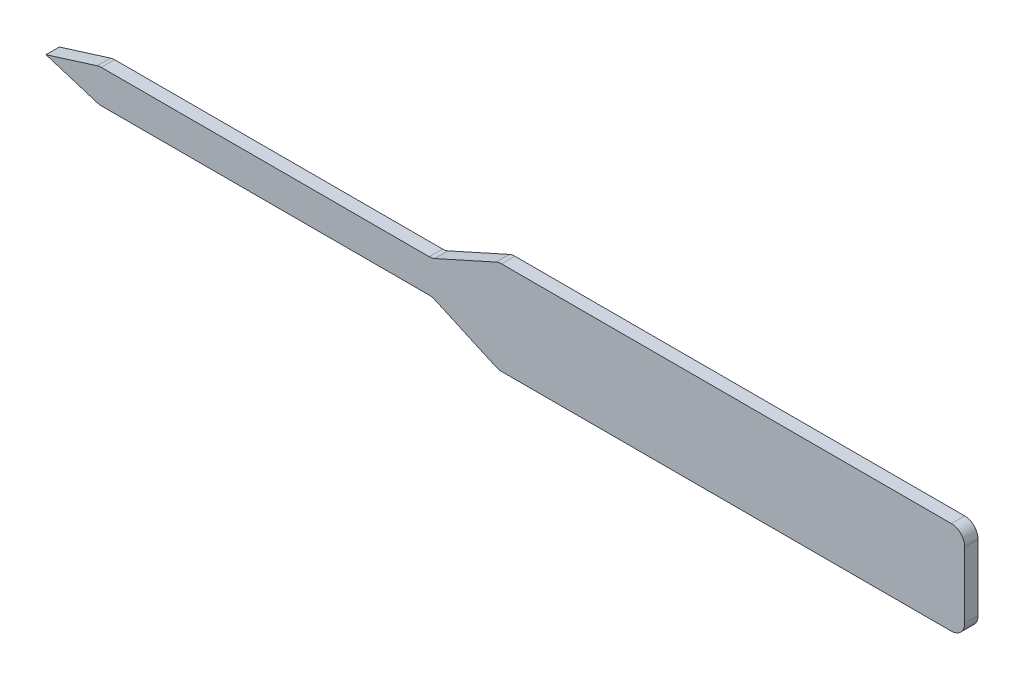
ISO-10303-21;
HEADER;
FILE_DESCRIPTION(('STEP AP214'),'2;1');
FILE_NAME('part.step','',(''),(''),'','','');
FILE_SCHEMA(('AUTOMOTIVE_DESIGN { 1 0 10303 214 1 1 1 1 }'));
ENDSEC;
DATA;
#1=APPLICATION_CONTEXT('core data for automotive mechanical design processes');
#2=APPLICATION_PROTOCOL_DEFINITION('international standard','automotive_design',2000,#1);
#3=PRODUCT_CONTEXT('',#1,'mechanical');
#4=PRODUCT('Part','Part','',(#3));
#5=PRODUCT_RELATED_PRODUCT_CATEGORY('part','',(#4));
#6=PRODUCT_DEFINITION_FORMATION('','',#4);
#7=PRODUCT_DEFINITION_CONTEXT('part definition',#1,'design');
#8=PRODUCT_DEFINITION('design','',#6,#7);
#9=PRODUCT_DEFINITION_SHAPE('','',#8);
#10=(LENGTH_UNIT() NAMED_UNIT(*) SI_UNIT(.MILLI.,.METRE.));
#11=(NAMED_UNIT(*) PLANE_ANGLE_UNIT() SI_UNIT($,.RADIAN.));
#12=(NAMED_UNIT(*) SI_UNIT($,.STERADIAN.) SOLID_ANGLE_UNIT());
#13=UNCERTAINTY_MEASURE_WITH_UNIT(LENGTH_MEASURE(1.E-05),#10,'distance_accuracy_value','');
#14=(GEOMETRIC_REPRESENTATION_CONTEXT(3) GLOBAL_UNCERTAINTY_ASSIGNED_CONTEXT((#13)) GLOBAL_UNIT_ASSIGNED_CONTEXT((#10,
#11,#12)) REPRESENTATION_CONTEXT('',''));
#15=CARTESIAN_POINT('',(0.,0.,0.));
#16=DIRECTION('',(0.,0.,1.));
#17=DIRECTION('',(1.,0.,0.));
#18=AXIS2_PLACEMENT_3D('',#15,#16,#17);
#19=CARTESIAN_POINT('',(35.,7.,2.));
#20=DIRECTION('',(-1.,0.,0.));
#21=DIRECTION('',(0.,0.,1.));
#22=AXIS2_PLACEMENT_3D('',#19,#20,#21);
#23=PLANE('',#22);
#24=DIRECTION('',(0.,1.,0.));
#25=VECTOR('',#24,1.);
#26=CARTESIAN_POINT('',(35.,7.,2.));
#27=LINE('',#26,#25);
#28=CARTESIAN_POINT('',(35.,-5.,2.));
#29=VERTEX_POINT('',#28);
#30=CARTESIAN_POINT('',(35.,5.,2.));
#31=VERTEX_POINT('',#30);
#32=EDGE_CURVE('E211',#29,#31,#27,.T.);
#33=ORIENTED_EDGE('',*,*,#32,.F.);
#34=DIRECTION('',(0.,0.,-1.));
#35=VECTOR('',#34,1.);
#36=CARTESIAN_POINT('',(35.,-5.,2.));
#37=LINE('',#36,#35);
#38=CARTESIAN_POINT('',(35.,-5.,0.));
#39=VERTEX_POINT('',#38);
#40=EDGE_CURVE('E268',#29,#39,#37,.T.);
#41=ORIENTED_EDGE('',*,*,#40,.T.);
#42=DIRECTION('',(0.,1.,0.));
#43=VECTOR('',#42,1.);
#44=CARTESIAN_POINT('',(35.,7.,0.));
#45=LINE('',#44,#43);
#46=CARTESIAN_POINT('',(35.,5.,0.));
#47=VERTEX_POINT('',#46);
#48=EDGE_CURVE('E189',#39,#47,#45,.T.);
#49=ORIENTED_EDGE('',*,*,#48,.T.);
#50=DIRECTION('',(0.,0.,-1.));
#51=VECTOR('',#50,1.);
#52=CARTESIAN_POINT('',(35.,5.,2.));
#53=LINE('',#52,#51);
#54=EDGE_CURVE('E266',#47,#31,#53,.F.);
#55=ORIENTED_EDGE('',*,*,#54,.T.);
#56=EDGE_LOOP('',(#33,#41,#49,#55));
#57=FACE_BOUND('',#56,.T.);
#58=ADVANCED_FACE('F33',(#57),#23,.F.);
#59=CARTESIAN_POINT('',(-35.,7.,2.));
#60=DIRECTION('',(0.,-1.,0.));
#61=DIRECTION('',(0.,0.,-1.));
#62=AXIS2_PLACEMENT_3D('',#59,#60,#61);
#63=PLANE('',#62);
#64=DIRECTION('',(-1.,0.,0.));
#65=VECTOR('',#64,1.);
#66=CARTESIAN_POINT('',(-35.,7.,0.));
#67=LINE('',#66,#65);
#68=CARTESIAN_POINT('',(33.,7.,0.));
#69=VERTEX_POINT('',#68);
#70=CARTESIAN_POINT('',(-34.5707306223419,7.,0.));
#71=VERTEX_POINT('',#70);
#72=EDGE_CURVE('E192',#69,#71,#67,.T.);
#73=ORIENTED_EDGE('',*,*,#72,.T.);
#74=DIRECTION('',(0.,0.,-1.));
#75=VECTOR('',#74,1.);
#76=CARTESIAN_POINT('',(-34.5707306223419,7.,2.));
#77=LINE('',#76,#75);
#78=CARTESIAN_POINT('',(-34.5707306223419,7.,2.));
#79=VERTEX_POINT('',#78);
#80=EDGE_CURVE('E255',#71,#79,#77,.F.);
#81=ORIENTED_EDGE('',*,*,#80,.T.);
#82=DIRECTION('',(-1.,0.,0.));
#83=VECTOR('',#82,1.);
#84=CARTESIAN_POINT('',(-35.,7.,2.));
#85=LINE('',#84,#83);
#86=CARTESIAN_POINT('',(33.,7.,2.));
#87=VERTEX_POINT('',#86);
#88=EDGE_CURVE('E294',#87,#79,#85,.T.);
#89=ORIENTED_EDGE('',*,*,#88,.F.);
#90=DIRECTION('',(0.,0.,-1.));
#91=VECTOR('',#90,1.);
#92=CARTESIAN_POINT('',(33.,7.,2.));
#93=LINE('',#92,#91);
#94=EDGE_CURVE('E252',#87,#69,#93,.T.);
#95=ORIENTED_EDGE('',*,*,#94,.T.);
#96=EDGE_LOOP('',(#73,#81,#89,#95));
#97=FACE_BOUND('',#96,.T.);
#98=ADVANCED_FACE('F311',(#97),#63,.F.);
#99=CARTESIAN_POINT('',(-35.,7.,2.));
#100=DIRECTION('',(0.410364677328798,-0.911921505175106,0.));
#101=DIRECTION('',(0.911921505175106,0.410364677328798,0.));
#102=AXIS2_PLACEMENT_3D('',#99,#100,#101);
#103=PLANE('',#102);
#104=DIRECTION('',(-0.911921505175106,-0.410364677328798,0.));
#105=VECTOR('',#104,1.);
#106=CARTESIAN_POINT('',(-35.,7.,2.));
#107=LINE('',#106,#105);
#108=CARTESIAN_POINT('',(-35.3914599769995,6.82384301035021,2.));
#109=VERTEX_POINT('',#108);
#110=CARTESIAN_POINT('',(-44.6085400230005,2.67615698964979,2.));
#111=VERTEX_POINT('',#110);
#112=EDGE_CURVE('E290',#109,#111,#107,.T.);
#113=ORIENTED_EDGE('',*,*,#112,.F.);
#114=DIRECTION('',(0.,0.,-1.));
#115=VECTOR('',#114,1.);
#116=CARTESIAN_POINT('',(-35.3914599769995,6.82384301035021,2.));
#117=LINE('',#116,#115);
#118=CARTESIAN_POINT('',(-35.3914599769995,6.82384301035021,0.));
#119=VERTEX_POINT('',#118);
#120=EDGE_CURVE('E249',#109,#119,#117,.T.);
#121=ORIENTED_EDGE('',*,*,#120,.T.);
#122=DIRECTION('',(-0.911921505175106,-0.410364677328798,0.));
#123=VECTOR('',#122,1.);
#124=CARTESIAN_POINT('',(-35.,7.,0.));
#125=LINE('',#124,#123);
#126=CARTESIAN_POINT('',(-44.6085400230005,2.67615698964979,0.));
#127=VERTEX_POINT('',#126);
#128=EDGE_CURVE('E195',#119,#127,#125,.T.);
#129=ORIENTED_EDGE('',*,*,#128,.T.);
#130=DIRECTION('',(0.,0.,-1.));
#131=VECTOR('',#130,1.);
#132=CARTESIAN_POINT('',(-44.6085400230005,2.67615698964979,2.));
#133=LINE('',#132,#131);
#134=EDGE_CURVE('E247',#127,#111,#133,.F.);
#135=ORIENTED_EDGE('',*,*,#134,.T.);
#136=EDGE_LOOP('',(#113,#121,#129,#135));
#137=FACE_BOUND('',#136,.T.);
#138=ADVANCED_FACE('F284',(#137),#103,.F.);
#139=CARTESIAN_POINT('',(-95.,2.5,2.));
#140=DIRECTION('',(0.,-1.,0.));
#141=DIRECTION('',(0.,0.,-1.));
#142=AXIS2_PLACEMENT_3D('',#139,#140,#141);
#143=PLANE('',#142);
#144=DIRECTION('',(-1.,0.,0.));
#145=VECTOR('',#144,1.);
#146=CARTESIAN_POINT('',(-95.,2.5,0.));
#147=LINE('',#146,#145);
#148=CARTESIAN_POINT('',(-45.4292693776581,2.5,0.));
#149=VERTEX_POINT('',#148);
#150=CARTESIAN_POINT('',(-94.6947781543039,2.5,0.));
#151=VERTEX_POINT('',#150);
#152=EDGE_CURVE('E198',#149,#151,#147,.T.);
#153=ORIENTED_EDGE('',*,*,#152,.T.);
#154=DIRECTION('',(0.,0.,-1.));
#155=VECTOR('',#154,1.);
#156=CARTESIAN_POINT('',(-94.6947781543039,2.5,2.));
#157=LINE('',#156,#155);
#158=CARTESIAN_POINT('',(-94.6947781543039,2.5,2.));
#159=VERTEX_POINT('',#158);
#160=EDGE_CURVE('E245',#151,#159,#157,.F.);
#161=ORIENTED_EDGE('',*,*,#160,.T.);
#162=DIRECTION('',(-1.,0.,0.));
#163=VECTOR('',#162,1.);
#164=CARTESIAN_POINT('',(-95.,2.5,2.));
#165=LINE('',#164,#163);
#166=CARTESIAN_POINT('',(-45.4292693776581,2.5,2.));
#167=VERTEX_POINT('',#166);
#168=EDGE_CURVE('E164',#167,#159,#165,.T.);
#169=ORIENTED_EDGE('',*,*,#168,.F.);
#170=DIRECTION('',(0.,0.,-1.));
#171=VECTOR('',#170,1.);
#172=CARTESIAN_POINT('',(-45.4292693776581,2.5,0.));
#173=LINE('',#172,#171);
#174=EDGE_CURVE('E242',#167,#149,#173,.T.);
#175=ORIENTED_EDGE('',*,*,#174,.T.);
#176=EDGE_LOOP('',(#153,#161,#169,#175));
#177=FACE_BOUND('',#176,.T.);
#178=ADVANCED_FACE('F292',(#177),#143,.F.);
#179=CARTESIAN_POINT('',(-95.,2.5,2.));
#180=DIRECTION('',(0.298274993135947,-0.95447997803503,0.));
#181=DIRECTION('',(0.95447997803503,0.298274993135947,0.));
#182=AXIS2_PLACEMENT_3D('',#179,#180,#181);
#183=PLANE('',#182);
#184=DIRECTION('',(-0.95447997803503,-0.298274993135947,0.));
#185=VECTOR('',#184,1.);
#186=CARTESIAN_POINT('',(-95.,2.5,2.));
#187=LINE('',#186,#185);
#188=CARTESIAN_POINT('',(-95.2913281405758,2.40895995607005,2.));
#189=VERTEX_POINT('',#188);
#190=CARTESIAN_POINT('',(-103.,0.,2.));
#191=VERTEX_POINT('',#190);
#192=EDGE_CURVE('E152',#189,#191,#187,.T.);
#193=ORIENTED_EDGE('',*,*,#192,.F.);
#194=DIRECTION('',(0.,0.,-1.));
#195=VECTOR('',#194,1.);
#196=CARTESIAN_POINT('',(-95.2913281405758,2.40895995607006,2.));
#197=LINE('',#196,#195);
#198=CARTESIAN_POINT('',(-95.2913281405758,2.40895995607005,0.));
#199=VERTEX_POINT('',#198);
#200=EDGE_CURVE('E240',#189,#199,#197,.T.);
#201=ORIENTED_EDGE('',*,*,#200,.T.);
#202=DIRECTION('',(-0.95447997803503,-0.298274993135947,0.));
#203=VECTOR('',#202,1.);
#204=CARTESIAN_POINT('',(-95.,2.5,0.));
#205=LINE('',#204,#203);
#206=CARTESIAN_POINT('',(-103.,0.,0.));
#207=VERTEX_POINT('',#206);
#208=EDGE_CURVE('E170',#199,#207,#205,.T.);
#209=ORIENTED_EDGE('',*,*,#208,.T.);
#210=DIRECTION('',(0.,0.,-1.));
#211=VECTOR('',#210,1.);
#212=CARTESIAN_POINT('',(-103.,0.,2.));
#213=LINE('',#212,#211);
#214=EDGE_CURVE('E167',#191,#207,#213,.T.);
#215=ORIENTED_EDGE('',*,*,#214,.F.);
#216=EDGE_LOOP('',(#193,#201,#209,#215));
#217=FACE_BOUND('',#216,.T.);
#218=ADVANCED_FACE('F168',(#217),#183,.F.);
#219=CARTESIAN_POINT('',(-103.,0.,2.));
#220=DIRECTION('',(0.298274993135948,0.95447997803503,0.));
#221=DIRECTION('',(-0.95447997803503,0.298274993135948,0.));
#222=AXIS2_PLACEMENT_3D('',#219,#220,#221);
#223=PLANE('',#222);
#224=DIRECTION('',(0.95447997803503,-0.298274993135948,0.));
#225=VECTOR('',#224,1.);
#226=CARTESIAN_POINT('',(-103.,0.,0.));
#227=LINE('',#226,#225);
#228=CARTESIAN_POINT('',(-95.2913281405758,-2.40895995607006,0.));
#229=VERTEX_POINT('',#228);
#230=EDGE_CURVE('E202',#207,#229,#227,.T.);
#231=ORIENTED_EDGE('',*,*,#230,.T.);
#232=DIRECTION('',(0.,0.,-1.));
#233=VECTOR('',#232,1.);
#234=CARTESIAN_POINT('',(-95.2913281405758,-2.40895995607006,2.));
#235=LINE('',#234,#233);
#236=CARTESIAN_POINT('',(-95.2913281405758,-2.40895995607006,2.));
#237=VERTEX_POINT('',#236);
#238=EDGE_CURVE('E179',#229,#237,#235,.F.);
#239=ORIENTED_EDGE('',*,*,#238,.T.);
#240=DIRECTION('',(0.95447997803503,-0.298274993135948,0.));
#241=VECTOR('',#240,1.);
#242=CARTESIAN_POINT('',(-103.,0.,2.));
#243=LINE('',#242,#241);
#244=EDGE_CURVE('E156',#191,#237,#243,.T.);
#245=ORIENTED_EDGE('',*,*,#244,.F.);
#246=ORIENTED_EDGE('',*,*,#214,.T.);
#247=EDGE_LOOP('',(#231,#239,#245,#246));
#248=FACE_BOUND('',#247,.T.);
#249=ADVANCED_FACE('F177',(#248),#223,.F.);
#250=CARTESIAN_POINT('',(-95.,-2.5,2.));
#251=DIRECTION('',(0.,1.,0.));
#252=DIRECTION('',(0.,0.,1.));
#253=AXIS2_PLACEMENT_3D('',#250,#251,#252);
#254=PLANE('',#253);
#255=DIRECTION('',(1.,0.,0.));
#256=VECTOR('',#255,1.);
#257=CARTESIAN_POINT('',(-95.,-2.5,2.));
#258=LINE('',#257,#256);
#259=CARTESIAN_POINT('',(-94.6947781543039,-2.5,2.));
#260=VERTEX_POINT('',#259);
#261=CARTESIAN_POINT('',(-45.4292693776581,-2.5,2.));
#262=VERTEX_POINT('',#261);
#263=EDGE_CURVE('E180',#260,#262,#258,.T.);
#264=ORIENTED_EDGE('',*,*,#263,.F.);
#265=DIRECTION('',(0.,0.,-1.));
#266=VECTOR('',#265,1.);
#267=CARTESIAN_POINT('',(-94.6947781543039,-2.5,2.));
#268=LINE('',#267,#266);
#269=CARTESIAN_POINT('',(-94.6947781543039,-2.5,0.));
#270=VERTEX_POINT('',#269);
#271=EDGE_CURVE('E214',#260,#270,#268,.T.);
#272=ORIENTED_EDGE('',*,*,#271,.T.);
#273=DIRECTION('',(1.,0.,0.));
#274=VECTOR('',#273,1.);
#275=CARTESIAN_POINT('',(-95.,-2.5,0.));
#276=LINE('',#275,#274);
#277=CARTESIAN_POINT('',(-45.4292693776581,-2.5,0.));
#278=VERTEX_POINT('',#277);
#279=EDGE_CURVE('E204',#270,#278,#276,.T.);
#280=ORIENTED_EDGE('',*,*,#279,.T.);
#281=DIRECTION('',(0.,0.,-1.));
#282=VECTOR('',#281,1.);
#283=CARTESIAN_POINT('',(-45.4292693776581,-2.5,2.));
#284=LINE('',#283,#282);
#285=EDGE_CURVE('E174',#278,#262,#284,.F.);
#286=ORIENTED_EDGE('',*,*,#285,.T.);
#287=EDGE_LOOP('',(#264,#272,#280,#286));
#288=FACE_BOUND('',#287,.T.);
#289=ADVANCED_FACE('F349',(#288),#254,.F.);
#290=CARTESIAN_POINT('',(-45.,-2.5,2.));
#291=DIRECTION('',(0.410364677328797,0.911921505175107,0.));
#292=DIRECTION('',(-0.911921505175107,0.410364677328797,0.));
#293=AXIS2_PLACEMENT_3D('',#290,#291,#292);
#294=PLANE('',#293);
#295=DIRECTION('',(0.911921505175107,-0.410364677328797,0.));
#296=VECTOR('',#295,1.);
#297=CARTESIAN_POINT('',(-45.,-2.5,0.));
#298=LINE('',#297,#296);
#299=CARTESIAN_POINT('',(-44.6085400230005,-2.67615698964979,0.));
#300=VERTEX_POINT('',#299);
#301=CARTESIAN_POINT('',(-35.3914599769995,-6.82384301035021,0.));
#302=VERTEX_POINT('',#301);
#303=EDGE_CURVE('E207',#300,#302,#298,.T.);
#304=ORIENTED_EDGE('',*,*,#303,.T.);
#305=DIRECTION('',(0.,0.,-1.));
#306=VECTOR('',#305,1.);
#307=CARTESIAN_POINT('',(-35.3914599769995,-6.82384301035022,2.));
#308=LINE('',#307,#306);
#309=CARTESIAN_POINT('',(-35.3914599769995,-6.82384301035021,2.));
#310=VERTEX_POINT('',#309);
#311=EDGE_CURVE('E264',#302,#310,#308,.F.);
#312=ORIENTED_EDGE('',*,*,#311,.T.);
#313=DIRECTION('',(0.911921505175107,-0.410364677328797,0.));
#314=VECTOR('',#313,1.);
#315=CARTESIAN_POINT('',(-45.,-2.5,2.));
#316=LINE('',#315,#314);
#317=CARTESIAN_POINT('',(-44.6085400230005,-2.67615698964979,2.));
#318=VERTEX_POINT('',#317);
#319=EDGE_CURVE('E183',#318,#310,#316,.T.);
#320=ORIENTED_EDGE('',*,*,#319,.F.);
#321=DIRECTION('',(0.,0.,-1.));
#322=VECTOR('',#321,1.);
#323=CARTESIAN_POINT('',(-44.6085400230005,-2.67615698964979,0.));
#324=LINE('',#323,#322);
#325=EDGE_CURVE('E261',#318,#300,#324,.T.);
#326=ORIENTED_EDGE('',*,*,#325,.T.);
#327=EDGE_LOOP('',(#304,#312,#320,#326));
#328=FACE_BOUND('',#327,.T.);
#329=ADVANCED_FACE('F355',(#328),#294,.F.);
#330=CARTESIAN_POINT('',(-35.,-7.,2.));
#331=DIRECTION('',(0.,1.,0.));
#332=DIRECTION('',(0.,0.,1.));
#333=AXIS2_PLACEMENT_3D('',#330,#331,#332);
#334=PLANE('',#333);
#335=DIRECTION('',(1.,0.,0.));
#336=VECTOR('',#335,1.);
#337=CARTESIAN_POINT('',(-35.,-7.,2.));
#338=LINE('',#337,#336);
#339=CARTESIAN_POINT('',(-34.5707306223419,-7.,2.));
#340=VERTEX_POINT('',#339);
#341=CARTESIAN_POINT('',(33.,-7.,2.));
#342=VERTEX_POINT('',#341);
#343=EDGE_CURVE('E175',#340,#342,#338,.T.);
#344=ORIENTED_EDGE('',*,*,#343,.F.);
#345=DIRECTION('',(0.,0.,-1.));
#346=VECTOR('',#345,1.);
#347=CARTESIAN_POINT('',(-34.5707306223419,-7.,2.));
#348=LINE('',#347,#346);
#349=CARTESIAN_POINT('',(-34.5707306223419,-7.,0.));
#350=VERTEX_POINT('',#349);
#351=EDGE_CURVE('E258',#340,#350,#348,.T.);
#352=ORIENTED_EDGE('',*,*,#351,.T.);
#353=DIRECTION('',(1.,0.,0.));
#354=VECTOR('',#353,1.);
#355=CARTESIAN_POINT('',(-35.,-7.,0.));
#356=LINE('',#355,#354);
#357=CARTESIAN_POINT('',(33.,-7.,0.));
#358=VERTEX_POINT('',#357);
#359=EDGE_CURVE('E210',#350,#358,#356,.T.);
#360=ORIENTED_EDGE('',*,*,#359,.T.);
#361=DIRECTION('',(0.,0.,-1.));
#362=VECTOR('',#361,1.);
#363=CARTESIAN_POINT('',(33.,-7.,2.));
#364=LINE('',#363,#362);
#365=EDGE_CURVE('E48',#358,#342,#364,.F.);
#366=ORIENTED_EDGE('',*,*,#365,.T.);
#367=EDGE_LOOP('',(#344,#352,#360,#366));
#368=FACE_BOUND('',#367,.T.);
#369=ADVANCED_FACE('F360',(#368),#334,.F.);
#370=CARTESIAN_POINT('',(0.,0.,2.));
#371=DIRECTION('',(0.,0.,1.));
#372=DIRECTION('',(1.,0.,0.));
#373=AXIS2_PLACEMENT_3D('',#370,#371,#372);
#374=PLANE('',#373);
#375=ORIENTED_EDGE('',*,*,#244,.T.);
#376=CARTESIAN_POINT('',(-94.6947781543039,-0.500000000000004,2.));
#377=DIRECTION('',(0.,0.,1.));
#378=DIRECTION('',(1.,0.,0.));
#379=AXIS2_PLACEMENT_3D('',#376,#377,#378);
#380=CIRCLE('',#379,2.);
#381=EDGE_CURVE('E238',#237,#260,#380,.T.);
#382=ORIENTED_EDGE('',*,*,#381,.T.);
#383=ORIENTED_EDGE('',*,*,#263,.T.);
#384=CARTESIAN_POINT('',(-45.4292693776581,-4.5,2.));
#385=DIRECTION('',(0.,0.,1.));
#386=DIRECTION('',(1.,0.,0.));
#387=AXIS2_PLACEMENT_3D('',#384,#385,#386);
#388=CIRCLE('',#387,2.);
#389=EDGE_CURVE('E273',#262,#318,#388,.F.);
#390=ORIENTED_EDGE('',*,*,#389,.T.);
#391=ORIENTED_EDGE('',*,*,#319,.T.);
#392=CARTESIAN_POINT('',(-34.5707306223419,-5.,2.));
#393=DIRECTION('',(0.,0.,1.));
#394=DIRECTION('',(1.,0.,0.));
#395=AXIS2_PLACEMENT_3D('',#392,#393,#394);
#396=CIRCLE('',#395,2.);
#397=EDGE_CURVE('E55',#310,#340,#396,.T.);
#398=ORIENTED_EDGE('',*,*,#397,.T.);
#399=ORIENTED_EDGE('',*,*,#343,.T.);
#400=CARTESIAN_POINT('',(33.,-5.,2.));
#401=DIRECTION('',(0.,0.,1.));
#402=DIRECTION('',(1.,0.,0.));
#403=AXIS2_PLACEMENT_3D('',#400,#401,#402);
#404=CIRCLE('',#403,2.);
#405=EDGE_CURVE('E232',#342,#29,#404,.T.);
#406=ORIENTED_EDGE('',*,*,#405,.T.);
#407=ORIENTED_EDGE('',*,*,#32,.T.);
#408=CARTESIAN_POINT('',(33.,5.,2.));
#409=DIRECTION('',(0.,0.,1.));
#410=DIRECTION('',(1.,0.,0.));
#411=AXIS2_PLACEMENT_3D('',#408,#409,#410);
#412=CIRCLE('',#411,2.);
#413=EDGE_CURVE('E230',#31,#87,#412,.T.);
#414=ORIENTED_EDGE('',*,*,#413,.T.);
#415=ORIENTED_EDGE('',*,*,#88,.T.);
#416=CARTESIAN_POINT('',(-34.5707306223419,5.,2.));
#417=DIRECTION('',(0.,0.,1.));
#418=DIRECTION('',(1.,0.,0.));
#419=AXIS2_PLACEMENT_3D('',#416,#417,#418);
#420=CIRCLE('',#419,2.);
#421=EDGE_CURVE('E235',#79,#109,#420,.T.);
#422=ORIENTED_EDGE('',*,*,#421,.T.);
#423=ORIENTED_EDGE('',*,*,#112,.T.);
#424=CARTESIAN_POINT('',(-45.4292693776581,4.5,2.));
#425=DIRECTION('',(0.,0.,1.));
#426=DIRECTION('',(1.,0.,0.));
#427=AXIS2_PLACEMENT_3D('',#424,#425,#426);
#428=CIRCLE('',#427,2.);
#429=EDGE_CURVE('E11',#111,#167,#428,.F.);
#430=ORIENTED_EDGE('',*,*,#429,.T.);
#431=ORIENTED_EDGE('',*,*,#168,.T.);
#432=CARTESIAN_POINT('',(-94.6947781543039,0.499999999999995,2.));
#433=DIRECTION('',(0.,0.,1.));
#434=DIRECTION('',(1.,0.,0.));
#435=AXIS2_PLACEMENT_3D('',#432,#433,#434);
#436=CIRCLE('',#435,2.);
#437=EDGE_CURVE('E160',#159,#189,#436,.T.);
#438=ORIENTED_EDGE('',*,*,#437,.T.);
#439=ORIENTED_EDGE('',*,*,#192,.T.);
#440=EDGE_LOOP('',(#375,#382,#383,#390,#391,#398,#399,#406,#407,#414,#415,#422,#423,#430,#431,
#438,#439));
#441=FACE_BOUND('',#440,.T.);
#442=ADVANCED_FACE('F154',(#441),#374,.T.);
#443=CARTESIAN_POINT('',(0.,0.,0.));
#444=DIRECTION('',(0.,0.,1.));
#445=DIRECTION('',(1.,0.,0.));
#446=AXIS2_PLACEMENT_3D('',#443,#444,#445);
#447=PLANE('',#446);
#448=ORIENTED_EDGE('',*,*,#279,.F.);
#449=CARTESIAN_POINT('',(-94.6947781543039,-0.500000000000004,0.));
#450=DIRECTION('',(0.,0.,1.));
#451=DIRECTION('',(1.,0.,0.));
#452=AXIS2_PLACEMENT_3D('',#449,#450,#451);
#453=CIRCLE('',#452,2.);
#454=EDGE_CURVE('E227',#270,#229,#453,.F.);
#455=ORIENTED_EDGE('',*,*,#454,.T.);
#456=ORIENTED_EDGE('',*,*,#230,.F.);
#457=ORIENTED_EDGE('',*,*,#208,.F.);
#458=CARTESIAN_POINT('',(-94.6947781543039,0.499999999999995,0.));
#459=DIRECTION('',(0.,0.,1.));
#460=DIRECTION('',(1.,0.,0.));
#461=AXIS2_PLACEMENT_3D('',#458,#459,#460);
#462=CIRCLE('',#461,2.);
#463=EDGE_CURVE('E225',#199,#151,#462,.F.);
#464=ORIENTED_EDGE('',*,*,#463,.T.);
#465=ORIENTED_EDGE('',*,*,#152,.F.);
#466=CARTESIAN_POINT('',(-45.4292693776581,4.5,0.));
#467=DIRECTION('',(0.,0.,1.));
#468=DIRECTION('',(1.,0.,0.));
#469=AXIS2_PLACEMENT_3D('',#466,#467,#468);
#470=CIRCLE('',#469,2.);
#471=EDGE_CURVE('E41',#149,#127,#470,.T.);
#472=ORIENTED_EDGE('',*,*,#471,.T.);
#473=ORIENTED_EDGE('',*,*,#128,.F.);
#474=CARTESIAN_POINT('',(-34.5707306223419,5.,0.));
#475=DIRECTION('',(0.,0.,1.));
#476=DIRECTION('',(1.,0.,0.));
#477=AXIS2_PLACEMENT_3D('',#474,#475,#476);
#478=CIRCLE('',#477,2.);
#479=EDGE_CURVE('E223',#119,#71,#478,.F.);
#480=ORIENTED_EDGE('',*,*,#479,.T.);
#481=ORIENTED_EDGE('',*,*,#72,.F.);
#482=CARTESIAN_POINT('',(33.,5.,0.));
#483=DIRECTION('',(0.,0.,1.));
#484=DIRECTION('',(1.,0.,0.));
#485=AXIS2_PLACEMENT_3D('',#482,#483,#484);
#486=CIRCLE('',#485,2.);
#487=EDGE_CURVE('E217',#69,#47,#486,.F.);
#488=ORIENTED_EDGE('',*,*,#487,.T.);
#489=ORIENTED_EDGE('',*,*,#48,.F.);
#490=CARTESIAN_POINT('',(33.,-5.,0.));
#491=DIRECTION('',(0.,0.,1.));
#492=DIRECTION('',(1.,0.,0.));
#493=AXIS2_PLACEMENT_3D('',#490,#491,#492);
#494=CIRCLE('',#493,2.);
#495=EDGE_CURVE('E219',#39,#358,#494,.F.);
#496=ORIENTED_EDGE('',*,*,#495,.T.);
#497=ORIENTED_EDGE('',*,*,#359,.F.);
#498=CARTESIAN_POINT('',(-34.5707306223419,-5.,0.));
#499=DIRECTION('',(0.,0.,1.));
#500=DIRECTION('',(1.,0.,0.));
#501=AXIS2_PLACEMENT_3D('',#498,#499,#500);
#502=CIRCLE('',#501,2.);
#503=EDGE_CURVE('E221',#350,#302,#502,.F.);
#504=ORIENTED_EDGE('',*,*,#503,.T.);
#505=ORIENTED_EDGE('',*,*,#303,.F.);
#506=CARTESIAN_POINT('',(-45.4292693776581,-4.5,0.));
#507=DIRECTION('',(0.,0.,1.));
#508=DIRECTION('',(1.,0.,0.));
#509=AXIS2_PLACEMENT_3D('',#506,#507,#508);
#510=CIRCLE('',#509,2.);
#511=EDGE_CURVE('E271',#300,#278,#510,.T.);
#512=ORIENTED_EDGE('',*,*,#511,.T.);
#513=EDGE_LOOP('',(#448,#455,#456,#457,#464,#465,#472,#473,#480,#481,#488,#489,#496,#497,#504,
#505,#512));
#514=FACE_BOUND('',#513,.T.);
#515=ADVANCED_FACE('F278',(#514),#447,.F.);
#516=CARTESIAN_POINT('',(-94.6947781543039,-0.500000000000004,2.));
#517=DIRECTION('',(0.,0.,-1.));
#518=DIRECTION('',(-1.,0.,0.));
#519=AXIS2_PLACEMENT_3D('',#516,#517,#518);
#520=CYLINDRICAL_SURFACE('',#519,2.);
#521=ORIENTED_EDGE('',*,*,#381,.F.);
#522=ORIENTED_EDGE('',*,*,#238,.F.);
#523=ORIENTED_EDGE('',*,*,#454,.F.);
#524=ORIENTED_EDGE('',*,*,#271,.F.);
#525=EDGE_LOOP('',(#521,#522,#523,#524));
#526=FACE_BOUND('',#525,.T.);
#527=ADVANCED_FACE('F328',(#526),#520,.T.);
#528=CARTESIAN_POINT('',(-94.6947781543039,0.499999999999995,2.));
#529=DIRECTION('',(0.,0.,-1.));
#530=DIRECTION('',(-1.,0.,0.));
#531=AXIS2_PLACEMENT_3D('',#528,#529,#530);
#532=CYLINDRICAL_SURFACE('',#531,2.);
#533=ORIENTED_EDGE('',*,*,#437,.F.);
#534=ORIENTED_EDGE('',*,*,#160,.F.);
#535=ORIENTED_EDGE('',*,*,#463,.F.);
#536=ORIENTED_EDGE('',*,*,#200,.F.);
#537=EDGE_LOOP('',(#533,#534,#535,#536));
#538=FACE_BOUND('',#537,.T.);
#539=ADVANCED_FACE('F319',(#538),#532,.T.);
#540=CARTESIAN_POINT('',(-34.5707306223419,5.,2.));
#541=DIRECTION('',(0.,0.,-1.));
#542=DIRECTION('',(-1.,0.,0.));
#543=AXIS2_PLACEMENT_3D('',#540,#541,#542);
#544=CYLINDRICAL_SURFACE('',#543,2.);
#545=ORIENTED_EDGE('',*,*,#421,.F.);
#546=ORIENTED_EDGE('',*,*,#80,.F.);
#547=ORIENTED_EDGE('',*,*,#479,.F.);
#548=ORIENTED_EDGE('',*,*,#120,.F.);
#549=EDGE_LOOP('',(#545,#546,#547,#548));
#550=FACE_BOUND('',#549,.T.);
#551=ADVANCED_FACE('F316',(#550),#544,.T.);
#552=CARTESIAN_POINT('',(-34.5707306223419,-5.,2.));
#553=DIRECTION('',(0.,0.,-1.));
#554=DIRECTION('',(-1.,0.,0.));
#555=AXIS2_PLACEMENT_3D('',#552,#553,#554);
#556=CYLINDRICAL_SURFACE('',#555,2.);
#557=ORIENTED_EDGE('',*,*,#397,.F.);
#558=ORIENTED_EDGE('',*,*,#311,.F.);
#559=ORIENTED_EDGE('',*,*,#503,.F.);
#560=ORIENTED_EDGE('',*,*,#351,.F.);
#561=EDGE_LOOP('',(#557,#558,#559,#560));
#562=FACE_BOUND('',#561,.T.);
#563=ADVANCED_FACE('F318',(#562),#556,.T.);
#564=CARTESIAN_POINT('',(-45.4292693776581,-4.5,2.));
#565=DIRECTION('',(0.,0.,1.));
#566=DIRECTION('',(1.,0.,0.));
#567=AXIS2_PLACEMENT_3D('',#564,#565,#566);
#568=CYLINDRICAL_SURFACE('',#567,2.);
#569=ORIENTED_EDGE('',*,*,#389,.F.);
#570=ORIENTED_EDGE('',*,*,#285,.F.);
#571=ORIENTED_EDGE('',*,*,#511,.F.);
#572=ORIENTED_EDGE('',*,*,#325,.F.);
#573=EDGE_LOOP('',(#569,#570,#571,#572));
#574=FACE_BOUND('',#573,.T.);
#575=ADVANCED_FACE('F325',(#574),#568,.F.);
#576=CARTESIAN_POINT('',(-45.4292693776581,4.5,2.));
#577=DIRECTION('',(0.,0.,1.));
#578=DIRECTION('',(1.,0.,0.));
#579=AXIS2_PLACEMENT_3D('',#576,#577,#578);
#580=CYLINDRICAL_SURFACE('',#579,2.);
#581=ORIENTED_EDGE('',*,*,#429,.F.);
#582=ORIENTED_EDGE('',*,*,#134,.F.);
#583=ORIENTED_EDGE('',*,*,#471,.F.);
#584=ORIENTED_EDGE('',*,*,#174,.F.);
#585=EDGE_LOOP('',(#581,#582,#583,#584));
#586=FACE_BOUND('',#585,.T.);
#587=ADVANCED_FACE('F288',(#586),#580,.F.);
#588=CARTESIAN_POINT('',(33.,-5.,2.));
#589=DIRECTION('',(0.,0.,-1.));
#590=DIRECTION('',(-1.,0.,0.));
#591=AXIS2_PLACEMENT_3D('',#588,#589,#590);
#592=CYLINDRICAL_SURFACE('',#591,2.);
#593=ORIENTED_EDGE('',*,*,#405,.F.);
#594=ORIENTED_EDGE('',*,*,#365,.F.);
#595=ORIENTED_EDGE('',*,*,#495,.F.);
#596=ORIENTED_EDGE('',*,*,#40,.F.);
#597=EDGE_LOOP('',(#593,#594,#595,#596));
#598=FACE_BOUND('',#597,.T.);
#599=ADVANCED_FACE('F362',(#598),#592,.T.);
#600=CARTESIAN_POINT('',(33.,5.,2.));
#601=DIRECTION('',(0.,0.,-1.));
#602=DIRECTION('',(-1.,0.,0.));
#603=AXIS2_PLACEMENT_3D('',#600,#601,#602);
#604=CYLINDRICAL_SURFACE('',#603,2.);
#605=ORIENTED_EDGE('',*,*,#413,.F.);
#606=ORIENTED_EDGE('',*,*,#54,.F.);
#607=ORIENTED_EDGE('',*,*,#487,.F.);
#608=ORIENTED_EDGE('',*,*,#94,.F.);
#609=EDGE_LOOP('',(#605,#606,#607,#608));
#610=FACE_BOUND('',#609,.T.);
#611=ADVANCED_FACE('F35',(#610),#604,.T.);
#612=CLOSED_SHELL('',(#58,#98,#138,#178,#218,#249,#289,#329,#369,#442,#515,#527,#539,#551,#563,
#575,#587,#599,#611));
#613=MANIFOLD_SOLID_BREP('B2',#612);
#614=ADVANCED_BREP_SHAPE_REPRESENTATION('',(#18,#613),#14);
#615=SHAPE_DEFINITION_REPRESENTATION(#9,#614);
ENDSEC;
END-ISO-10303-21;
